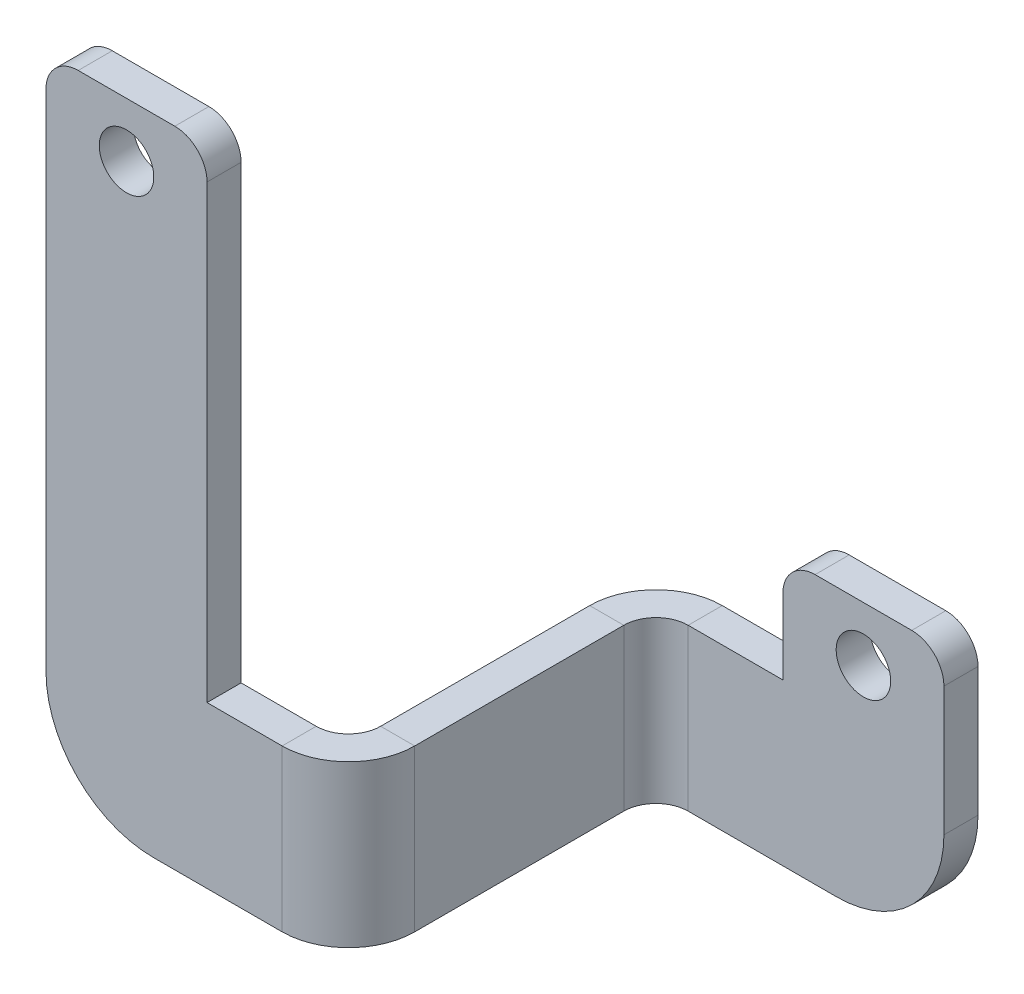
ISO-10303-21;
HEADER;
FILE_DESCRIPTION(('STEP AP214'),'2;1');
FILE_NAME('part.step','',(''),(''),'','','');
FILE_SCHEMA(('AUTOMOTIVE_DESIGN { 1 0 10303 214 1 1 1 1 }'));
ENDSEC;
DATA;
#1=APPLICATION_CONTEXT('core data for automotive mechanical design processes');
#2=APPLICATION_PROTOCOL_DEFINITION('international standard','automotive_design',2000,#1);
#3=PRODUCT_CONTEXT('',#1,'mechanical');
#4=PRODUCT('Part','Part','',(#3));
#5=PRODUCT_RELATED_PRODUCT_CATEGORY('part','',(#4));
#6=PRODUCT_DEFINITION_FORMATION('','',#4);
#7=PRODUCT_DEFINITION_CONTEXT('part definition',#1,'design');
#8=PRODUCT_DEFINITION('design','',#6,#7);
#9=PRODUCT_DEFINITION_SHAPE('','',#8);
#10=(LENGTH_UNIT() NAMED_UNIT(*) SI_UNIT(.MILLI.,.METRE.));
#11=(NAMED_UNIT(*) PLANE_ANGLE_UNIT() SI_UNIT($,.RADIAN.));
#12=(NAMED_UNIT(*) SI_UNIT($,.STERADIAN.) SOLID_ANGLE_UNIT());
#13=UNCERTAINTY_MEASURE_WITH_UNIT(LENGTH_MEASURE(1.E-05),#10,'distance_accuracy_value','');
#14=(GEOMETRIC_REPRESENTATION_CONTEXT(3) GLOBAL_UNCERTAINTY_ASSIGNED_CONTEXT((#13)) GLOBAL_UNIT_ASSIGNED_CONTEXT((#10,
#11,#12)) REPRESENTATION_CONTEXT('',''));
#15=CARTESIAN_POINT('',(0.,0.,0.));
#16=DIRECTION('',(0.,0.,1.));
#17=DIRECTION('',(1.,0.,0.));
#18=AXIS2_PLACEMENT_3D('',#15,#16,#17);
#19=CARTESIAN_POINT('',(15.6750000000001,7.5,-31.825));
#20=DIRECTION('',(0.,1.,0.));
#21=DIRECTION('',(0.,0.,1.));
#22=AXIS2_PLACEMENT_3D('',#19,#20,#21);
#23=PLANE('',#22);
#24=DIRECTION('',(-1.,0.,0.));
#25=VECTOR('',#24,1.);
#26=CARTESIAN_POINT('',(15.6750000000001,7.5,-28.65));
#27=LINE('',#26,#25);
#28=CARTESIAN_POINT('',(27.5000000000001,7.5,-28.65));
#29=VERTEX_POINT('',#28);
#30=CARTESIAN_POINT('',(18.6750000000001,7.5,-28.65));
#31=VERTEX_POINT('',#30);
#32=EDGE_CURVE('E208',#29,#31,#27,.T.);
#33=ORIENTED_EDGE('',*,*,#32,.F.);
#34=DIRECTION('',(0.,0.,1.));
#35=VECTOR('',#34,1.);
#36=CARTESIAN_POINT('',(27.5000000000001,7.5,-31.825));
#37=LINE('',#36,#35);
#38=CARTESIAN_POINT('',(27.5000000000001,7.5,-31.825));
#39=VERTEX_POINT('',#38);
#40=EDGE_CURVE('E194',#39,#29,#37,.T.);
#41=ORIENTED_EDGE('',*,*,#40,.F.);
#42=DIRECTION('',(-1.,0.,0.));
#43=VECTOR('',#42,1.);
#44=CARTESIAN_POINT('',(15.6750000000001,7.5,-31.825));
#45=LINE('',#44,#43);
#46=CARTESIAN_POINT('',(18.6750000000001,7.5,-31.825));
#47=VERTEX_POINT('',#46);
#48=EDGE_CURVE('E206',#39,#47,#45,.T.);
#49=ORIENTED_EDGE('',*,*,#48,.T.);
#50=DIRECTION('',(0.,0.,-1.));
#51=VECTOR('',#50,1.);
#52=CARTESIAN_POINT('',(18.6750000000001,7.5,-28.65));
#53=LINE('',#52,#51);
#54=EDGE_CURVE('E402',#31,#47,#53,.T.);
#55=ORIENTED_EDGE('',*,*,#54,.F.);
#56=EDGE_LOOP('',(#33,#41,#49,#55));
#57=FACE_BOUND('',#56,.T.);
#58=ADVANCED_FACE('F43',(#57),#23,.T.);
#59=CARTESIAN_POINT('',(-12.5,7.5,-3.175));
#60=DIRECTION('',(0.,1.,0.));
#61=DIRECTION('',(0.,0.,1.));
#62=AXIS2_PLACEMENT_3D('',#59,#60,#61);
#63=PLANE('',#62);
#64=DIRECTION('',(-1.,0.,0.));
#65=VECTOR('',#64,1.);
#66=CARTESIAN_POINT('',(-12.5,7.5,-3.175));
#67=LINE('',#66,#65);
#68=CARTESIAN_POINT('',(9.50000000000002,7.5,-3.175));
#69=VERTEX_POINT('',#68);
#70=CARTESIAN_POINT('',(2.5,7.5,-3.175));
#71=VERTEX_POINT('',#70);
#72=EDGE_CURVE('E297',#69,#71,#67,.T.);
#73=ORIENTED_EDGE('',*,*,#72,.T.);
#74=DIRECTION('',(0.,0.,-1.));
#75=VECTOR('',#74,1.);
#76=CARTESIAN_POINT('',(2.5,7.5,-3.175));
#77=LINE('',#76,#75);
#78=CARTESIAN_POINT('',(2.5,7.5,0.));
#79=VERTEX_POINT('',#78);
#80=EDGE_CURVE('E390',#79,#71,#77,.T.);
#81=ORIENTED_EDGE('',*,*,#80,.F.);
#82=DIRECTION('',(-1.,0.,0.));
#83=VECTOR('',#82,1.);
#84=CARTESIAN_POINT('',(-12.5,7.5,0.));
#85=LINE('',#84,#83);
#86=CARTESIAN_POINT('',(9.50000000000002,7.5,0.));
#87=VERTEX_POINT('',#86);
#88=EDGE_CURVE('E294',#87,#79,#85,.T.);
#89=ORIENTED_EDGE('',*,*,#88,.F.);
#90=DIRECTION('',(0.,0.,1.));
#91=VECTOR('',#90,1.);
#92=CARTESIAN_POINT('',(9.50000000000002,7.5,-3.175));
#93=LINE('',#92,#91);
#94=EDGE_CURVE('E291',#69,#87,#93,.T.);
#95=ORIENTED_EDGE('',*,*,#94,.F.);
#96=EDGE_LOOP('',(#73,#81,#89,#95));
#97=FACE_BOUND('',#96,.T.);
#98=ADVANCED_FACE('F458',(#97),#63,.T.);
#99=CARTESIAN_POINT('',(15.6750000000001,7.5,-28.65));
#100=DIRECTION('',(0.,1.,0.));
#101=DIRECTION('',(0.,0.,1.));
#102=AXIS2_PLACEMENT_3D('',#99,#100,#101);
#103=PLANE('',#102);
#104=DIRECTION('',(0.,0.,-1.));
#105=VECTOR('',#104,1.);
#106=CARTESIAN_POINT('',(15.6750000000001,7.5,-28.65));
#107=LINE('',#106,#105);
#108=CARTESIAN_POINT('',(15.675,7.5,-6.17499999999998));
#109=VERTEX_POINT('',#108);
#110=CARTESIAN_POINT('',(15.6750000000001,7.5,-25.65));
#111=VERTEX_POINT('',#110);
#112=EDGE_CURVE('E264',#109,#111,#107,.T.);
#113=ORIENTED_EDGE('',*,*,#112,.T.);
#114=DIRECTION('',(-1.,0.,0.));
#115=VECTOR('',#114,1.);
#116=CARTESIAN_POINT('',(15.6750000000001,7.5,-25.65));
#117=LINE('',#116,#115);
#118=CARTESIAN_POINT('',(12.5000000000001,7.5,-25.65));
#119=VERTEX_POINT('',#118);
#120=EDGE_CURVE('E239',#111,#119,#117,.T.);
#121=ORIENTED_EDGE('',*,*,#120,.T.);
#122=DIRECTION('',(0.,0.,-1.));
#123=VECTOR('',#122,1.);
#124=CARTESIAN_POINT('',(12.5000000000001,7.5,-28.65));
#125=LINE('',#124,#123);
#126=CARTESIAN_POINT('',(12.5,7.5,-6.17499999999999));
#127=VERTEX_POINT('',#126);
#128=EDGE_CURVE('E263',#127,#119,#125,.T.);
#129=ORIENTED_EDGE('',*,*,#128,.F.);
#130=DIRECTION('',(1.,0.,0.));
#131=VECTOR('',#130,1.);
#132=CARTESIAN_POINT('',(12.5,7.5,-6.17499999999999));
#133=LINE('',#132,#131);
#134=EDGE_CURVE('E250',#127,#109,#133,.T.);
#135=ORIENTED_EDGE('',*,*,#134,.T.);
#136=EDGE_LOOP('',(#113,#121,#129,#135));
#137=FACE_BOUND('',#136,.T.);
#138=ADVANCED_FACE('F463',(#137),#103,.T.);
#139=CARTESIAN_POINT('',(15.675,0.,0.));
#140=DIRECTION('',(1.,0.,0.));
#141=DIRECTION('',(0.,0.,-1.));
#142=AXIS2_PLACEMENT_3D('',#139,#140,#141);
#143=PLANE('',#142);
#144=DIRECTION('',(0.,0.,1.));
#145=VECTOR('',#144,1.);
#146=CARTESIAN_POINT('',(15.675,-7.5,-3.17499999999999));
#147=LINE('',#146,#145);
#148=CARTESIAN_POINT('',(15.6750000000001,-7.5,-25.65));
#149=VERTEX_POINT('',#148);
#150=CARTESIAN_POINT('',(15.675,-7.5,-6.17499999999998));
#151=VERTEX_POINT('',#150);
#152=EDGE_CURVE('E267',#149,#151,#147,.T.);
#153=ORIENTED_EDGE('',*,*,#152,.F.);
#154=DIRECTION('',(0.,1.,0.));
#155=VECTOR('',#154,1.);
#156=CARTESIAN_POINT('',(15.6750000000001,7.5,-25.65));
#157=LINE('',#156,#155);
#158=EDGE_CURVE('E221',#111,#149,#157,.F.);
#159=ORIENTED_EDGE('',*,*,#158,.F.);
#160=ORIENTED_EDGE('',*,*,#112,.F.);
#161=DIRECTION('',(0.,-1.,0.));
#162=VECTOR('',#161,1.);
#163=CARTESIAN_POINT('',(15.675,0.,-6.17499999999998));
#164=LINE('',#163,#162);
#165=EDGE_CURVE('E258',#109,#151,#164,.T.);
#166=ORIENTED_EDGE('',*,*,#165,.T.);
#167=EDGE_LOOP('',(#153,#159,#160,#166));
#168=FACE_BOUND('',#167,.T.);
#169=ADVANCED_FACE('F491',(#168),#143,.T.);
#170=CARTESIAN_POINT('',(12.5,0.,0.));
#171=DIRECTION('',(1.,0.,0.));
#172=DIRECTION('',(0.,0.,-1.));
#173=AXIS2_PLACEMENT_3D('',#170,#171,#172);
#174=PLANE('',#173);
#175=DIRECTION('',(0.,1.,0.));
#176=VECTOR('',#175,1.);
#177=CARTESIAN_POINT('',(12.5000000000001,7.5,-25.65));
#178=LINE('',#177,#176);
#179=CARTESIAN_POINT('',(12.5000000000001,-7.5,-25.65));
#180=VERTEX_POINT('',#179);
#181=EDGE_CURVE('E233',#119,#180,#178,.F.);
#182=ORIENTED_EDGE('',*,*,#181,.T.);
#183=DIRECTION('',(0.,0.,1.));
#184=VECTOR('',#183,1.);
#185=CARTESIAN_POINT('',(12.5,-7.5,-3.175));
#186=LINE('',#185,#184);
#187=CARTESIAN_POINT('',(12.5,-7.5,-6.17499999999999));
#188=VERTEX_POINT('',#187);
#189=EDGE_CURVE('E268',#180,#188,#186,.T.);
#190=ORIENTED_EDGE('',*,*,#189,.T.);
#191=DIRECTION('',(0.,-1.,0.));
#192=VECTOR('',#191,1.);
#193=CARTESIAN_POINT('',(12.5,7.5,-6.17499999999999));
#194=LINE('',#193,#192);
#195=EDGE_CURVE('E252',#127,#188,#194,.T.);
#196=ORIENTED_EDGE('',*,*,#195,.F.);
#197=ORIENTED_EDGE('',*,*,#128,.T.);
#198=EDGE_LOOP('',(#182,#190,#196,#197));
#199=FACE_BOUND('',#198,.T.);
#200=ADVANCED_FACE('F494',(#199),#174,.F.);
#201=CARTESIAN_POINT('',(-12.5,-7.5,-3.175));
#202=DIRECTION('',(0.,-1.,0.));
#203=DIRECTION('',(0.,0.,-1.));
#204=AXIS2_PLACEMENT_3D('',#201,#202,#203);
#205=PLANE('',#204);
#206=DIRECTION('',(1.,0.,0.));
#207=VECTOR('',#206,1.);
#208=CARTESIAN_POINT('',(-12.5,-7.5,0.));
#209=LINE('',#208,#207);
#210=CARTESIAN_POINT('',(-2.5,-7.5,0.));
#211=VERTEX_POINT('',#210);
#212=CARTESIAN_POINT('',(9.50000000000002,-7.5,0.));
#213=VERTEX_POINT('',#212);
#214=EDGE_CURVE('E301',#211,#213,#209,.T.);
#215=ORIENTED_EDGE('',*,*,#214,.F.);
#216=DIRECTION('',(0.,0.,1.));
#217=VECTOR('',#216,1.);
#218=CARTESIAN_POINT('',(-2.5,-7.5,-3.175));
#219=LINE('',#218,#217);
#220=CARTESIAN_POINT('',(-2.5,-7.5,-3.175));
#221=VERTEX_POINT('',#220);
#222=EDGE_CURVE('E51',#211,#221,#219,.F.);
#223=ORIENTED_EDGE('',*,*,#222,.T.);
#224=DIRECTION('',(1.,0.,0.));
#225=VECTOR('',#224,1.);
#226=CARTESIAN_POINT('',(-12.5,-7.5,-3.175));
#227=LINE('',#226,#225);
#228=CARTESIAN_POINT('',(9.50000000000002,-7.5,-3.175));
#229=VERTEX_POINT('',#228);
#230=EDGE_CURVE('E304',#221,#229,#227,.T.);
#231=ORIENTED_EDGE('',*,*,#230,.T.);
#232=DIRECTION('',(0.,0.,1.));
#233=VECTOR('',#232,1.);
#234=CARTESIAN_POINT('',(9.50000000000002,-7.5,-3.175));
#235=LINE('',#234,#233);
#236=EDGE_CURVE('E280',#229,#213,#235,.T.);
#237=ORIENTED_EDGE('',*,*,#236,.T.);
#238=EDGE_LOOP('',(#215,#223,#231,#237));
#239=FACE_BOUND('',#238,.T.);
#240=ADVANCED_FACE('F448',(#239),#205,.T.);
#241=CARTESIAN_POINT('',(0.,0.,-3.175));
#242=DIRECTION('',(0.,0.,-1.));
#243=DIRECTION('',(-1.,0.,0.));
#244=AXIS2_PLACEMENT_3D('',#241,#242,#243);
#245=PLANE('',#244);
#246=CARTESIAN_POINT('',(-5.,47.42,-3.175));
#247=DIRECTION('',(0.,0.,-1.));
#248=DIRECTION('',(-1.,0.,0.));
#249=AXIS2_PLACEMENT_3D('',#246,#247,#248);
#250=CIRCLE('',#249,2.54000000000001);
#251=CARTESIAN_POINT('',(-7.54,47.42,-3.175));
#252=VERTEX_POINT('',#251);
#253=EDGE_CURVE('E201',#252,#252,#250,.T.);
#254=ORIENTED_EDGE('',*,*,#253,.F.);
#255=EDGE_LOOP('',(#254));
#256=FACE_BOUND('',#255,.T.);
#257=ORIENTED_EDGE('',*,*,#230,.F.);
#258=CARTESIAN_POINT('',(-2.5,2.5,-3.175));
#259=DIRECTION('',(0.,0.,-1.));
#260=DIRECTION('',(-1.,0.,0.));
#261=AXIS2_PLACEMENT_3D('',#258,#259,#260);
#262=CIRCLE('',#261,10.);
#263=CARTESIAN_POINT('',(-12.5,2.5,-3.175));
#264=VERTEX_POINT('',#263);
#265=EDGE_CURVE('E11',#221,#264,#262,.T.);
#266=ORIENTED_EDGE('',*,*,#265,.T.);
#267=DIRECTION('',(0.,-1.,0.));
#268=VECTOR('',#267,1.);
#269=CARTESIAN_POINT('',(-12.5,-7.5,-3.175));
#270=LINE('',#269,#268);
#271=CARTESIAN_POINT('',(-12.5,49.5,-3.175));
#272=VERTEX_POINT('',#271);
#273=EDGE_CURVE('E300',#272,#264,#270,.T.);
#274=ORIENTED_EDGE('',*,*,#273,.F.);
#275=CARTESIAN_POINT('',(-9.49999999999999,49.5,-3.175));
#276=DIRECTION('',(0.,0.,-1.));
#277=DIRECTION('',(-1.,0.,0.));
#278=AXIS2_PLACEMENT_3D('',#275,#276,#277);
#279=CIRCLE('',#278,3.);
#280=CARTESIAN_POINT('',(-9.49999999999999,52.5,-3.175));
#281=VERTEX_POINT('',#280);
#282=EDGE_CURVE('E339',#272,#281,#279,.T.);
#283=ORIENTED_EDGE('',*,*,#282,.T.);
#284=DIRECTION('',(-1.,0.,0.));
#285=VECTOR('',#284,1.);
#286=CARTESIAN_POINT('',(-12.5,52.5,-3.175));
#287=LINE('',#286,#285);
#288=CARTESIAN_POINT('',(-0.499999999999995,52.5,-3.175));
#289=VERTEX_POINT('',#288);
#290=EDGE_CURVE('E384',#289,#281,#287,.T.);
#291=ORIENTED_EDGE('',*,*,#290,.F.);
#292=CARTESIAN_POINT('',(-0.499999999999996,49.5,-3.175));
#293=DIRECTION('',(0.,0.,-1.));
#294=DIRECTION('',(-1.,0.,0.));
#295=AXIS2_PLACEMENT_3D('',#292,#293,#294);
#296=CIRCLE('',#295,3.);
#297=CARTESIAN_POINT('',(2.5,49.5,-3.175));
#298=VERTEX_POINT('',#297);
#299=EDGE_CURVE('E341',#289,#298,#296,.T.);
#300=ORIENTED_EDGE('',*,*,#299,.T.);
#301=DIRECTION('',(0.,-1.,0.));
#302=VECTOR('',#301,1.);
#303=CARTESIAN_POINT('',(2.5,52.5,-3.175));
#304=LINE('',#303,#302);
#305=EDGE_CURVE('E386',#298,#71,#304,.T.);
#306=ORIENTED_EDGE('',*,*,#305,.T.);
#307=ORIENTED_EDGE('',*,*,#72,.F.);
#308=DIRECTION('',(0.,-1.,0.));
#309=VECTOR('',#308,1.);
#310=CARTESIAN_POINT('',(9.50000000000002,-7.5,-3.175));
#311=LINE('',#310,#309);
#312=EDGE_CURVE('E286',#229,#69,#311,.F.);
#313=ORIENTED_EDGE('',*,*,#312,.F.);
#314=EDGE_LOOP('',(#257,#266,#274,#283,#291,#300,#306,#307,#313));
#315=FACE_BOUND('',#314,.T.);
#316=ADVANCED_FACE('F446',(#256,#315),#245,.T.);
#317=CARTESIAN_POINT('',(0.,0.,0.));
#318=DIRECTION('',(0.,0.,-1.));
#319=DIRECTION('',(-1.,0.,0.));
#320=AXIS2_PLACEMENT_3D('',#317,#318,#319);
#321=PLANE('',#320);
#322=CARTESIAN_POINT('',(-5.,47.42,0.));
#323=DIRECTION('',(0.,0.,-1.));
#324=DIRECTION('',(-1.,0.,0.));
#325=AXIS2_PLACEMENT_3D('',#322,#323,#324);
#326=CIRCLE('',#325,2.54000000000001);
#327=CARTESIAN_POINT('',(-7.54,47.42,0.));
#328=VERTEX_POINT('',#327);
#329=EDGE_CURVE('E395',#328,#328,#326,.T.);
#330=ORIENTED_EDGE('',*,*,#329,.T.);
#331=EDGE_LOOP('',(#330));
#332=FACE_BOUND('',#331,.T.);
#333=DIRECTION('',(0.,-1.,0.));
#334=VECTOR('',#333,1.);
#335=CARTESIAN_POINT('',(-12.5,-7.5,0.));
#336=LINE('',#335,#334);
#337=CARTESIAN_POINT('',(-12.5,49.5,0.));
#338=VERTEX_POINT('',#337);
#339=CARTESIAN_POINT('',(-12.5,2.5,0.));
#340=VERTEX_POINT('',#339);
#341=EDGE_CURVE('E309',#338,#340,#336,.T.);
#342=ORIENTED_EDGE('',*,*,#341,.T.);
#343=CARTESIAN_POINT('',(-2.5,2.5,0.));
#344=DIRECTION('',(0.,0.,-1.));
#345=DIRECTION('',(-1.,0.,0.));
#346=AXIS2_PLACEMENT_3D('',#343,#344,#345);
#347=CIRCLE('',#346,10.);
#348=EDGE_CURVE('E65',#340,#211,#347,.F.);
#349=ORIENTED_EDGE('',*,*,#348,.T.);
#350=ORIENTED_EDGE('',*,*,#214,.T.);
#351=DIRECTION('',(0.,-1.,0.));
#352=VECTOR('',#351,1.);
#353=CARTESIAN_POINT('',(9.50000000000002,-7.5,0.));
#354=LINE('',#353,#352);
#355=EDGE_CURVE('E274',#213,#87,#354,.F.);
#356=ORIENTED_EDGE('',*,*,#355,.T.);
#357=ORIENTED_EDGE('',*,*,#88,.T.);
#358=DIRECTION('',(0.,-1.,0.));
#359=VECTOR('',#358,1.);
#360=CARTESIAN_POINT('',(2.5,52.5,0.));
#361=LINE('',#360,#359);
#362=CARTESIAN_POINT('',(2.5,49.5,0.));
#363=VERTEX_POINT('',#362);
#364=EDGE_CURVE('E388',#363,#79,#361,.T.);
#365=ORIENTED_EDGE('',*,*,#364,.F.);
#366=CARTESIAN_POINT('',(-0.499999999999996,49.5,0.));
#367=DIRECTION('',(0.,0.,-1.));
#368=DIRECTION('',(-1.,0.,0.));
#369=AXIS2_PLACEMENT_3D('',#366,#367,#368);
#370=CIRCLE('',#369,3.);
#371=CARTESIAN_POINT('',(-0.499999999999999,52.5,0.));
#372=VERTEX_POINT('',#371);
#373=EDGE_CURVE('E347',#363,#372,#370,.F.);
#374=ORIENTED_EDGE('',*,*,#373,.T.);
#375=DIRECTION('',(1.,0.,0.));
#376=VECTOR('',#375,1.);
#377=CARTESIAN_POINT('',(-12.5,52.5,0.));
#378=LINE('',#377,#376);
#379=CARTESIAN_POINT('',(-9.49999999999999,52.5,0.));
#380=VERTEX_POINT('',#379);
#381=EDGE_CURVE('E374',#380,#372,#378,.T.);
#382=ORIENTED_EDGE('',*,*,#381,.F.);
#383=CARTESIAN_POINT('',(-9.49999999999999,49.5,0.));
#384=DIRECTION('',(0.,0.,-1.));
#385=DIRECTION('',(-1.,0.,0.));
#386=AXIS2_PLACEMENT_3D('',#383,#384,#385);
#387=CIRCLE('',#386,3.);
#388=EDGE_CURVE('E345',#380,#338,#387,.F.);
#389=ORIENTED_EDGE('',*,*,#388,.T.);
#390=EDGE_LOOP('',(#342,#349,#350,#356,#357,#365,#374,#382,#389));
#391=FACE_BOUND('',#390,.T.);
#392=ADVANCED_FACE('F371',(#332,#391),#321,.F.);
#393=CARTESIAN_POINT('',(-12.5,-7.5,-3.175));
#394=DIRECTION('',(-1.,0.,0.));
#395=DIRECTION('',(0.,0.,1.));
#396=AXIS2_PLACEMENT_3D('',#393,#394,#395);
#397=PLANE('',#396);
#398=ORIENTED_EDGE('',*,*,#273,.T.);
#399=DIRECTION('',(0.,0.,1.));
#400=VECTOR('',#399,1.);
#401=CARTESIAN_POINT('',(-12.5,2.5,-3.175));
#402=LINE('',#401,#400);
#403=EDGE_CURVE('E360',#264,#340,#402,.T.);
#404=ORIENTED_EDGE('',*,*,#403,.T.);
#405=ORIENTED_EDGE('',*,*,#341,.F.);
#406=DIRECTION('',(0.,0.,1.));
#407=VECTOR('',#406,1.);
#408=CARTESIAN_POINT('',(-12.5,49.5,-3.175));
#409=LINE('',#408,#407);
#410=EDGE_CURVE('E349',#338,#272,#409,.F.);
#411=ORIENTED_EDGE('',*,*,#410,.T.);
#412=EDGE_LOOP('',(#398,#404,#405,#411));
#413=FACE_BOUND('',#412,.T.);
#414=ADVANCED_FACE('F366',(#413),#397,.T.);
#415=CARTESIAN_POINT('',(9.50000000000002,7.5,-6.175));
#416=DIRECTION('',(0.,1.,0.));
#417=DIRECTION('',(0.,0.,1.));
#418=AXIS2_PLACEMENT_3D('',#415,#416,#417);
#419=PLANE('',#418);
#420=ORIENTED_EDGE('',*,*,#134,.F.);
#421=CARTESIAN_POINT('',(9.50000000000002,7.5,-6.175));
#422=DIRECTION('',(0.,-1.,0.));
#423=DIRECTION('',(0.,0.,-1.));
#424=AXIS2_PLACEMENT_3D('',#421,#422,#423);
#425=CIRCLE('',#424,3.);
#426=EDGE_CURVE('E283',#69,#127,#425,.F.);
#427=ORIENTED_EDGE('',*,*,#426,.F.);
#428=ORIENTED_EDGE('',*,*,#94,.T.);
#429=CARTESIAN_POINT('',(9.50000000000002,7.5,-6.175));
#430=DIRECTION('',(0.,-1.,0.));
#431=DIRECTION('',(0.,0.,-1.));
#432=AXIS2_PLACEMENT_3D('',#429,#430,#431);
#433=CIRCLE('',#432,6.175);
#434=EDGE_CURVE('E276',#87,#109,#433,.F.);
#435=ORIENTED_EDGE('',*,*,#434,.T.);
#436=EDGE_LOOP('',(#420,#427,#428,#435));
#437=FACE_BOUND('',#436,.T.);
#438=ADVANCED_FACE('F514',(#437),#419,.T.);
#439=CARTESIAN_POINT('',(9.50000000000002,-7.5,-6.175));
#440=DIRECTION('',(0.,1.,0.));
#441=DIRECTION('',(0.,0.,1.));
#442=AXIS2_PLACEMENT_3D('',#439,#440,#441);
#443=PLANE('',#442);
#444=CARTESIAN_POINT('',(9.50000000000002,-7.5,-6.175));
#445=DIRECTION('',(0.,-1.,0.));
#446=DIRECTION('',(0.,0.,-1.));
#447=AXIS2_PLACEMENT_3D('',#444,#445,#446);
#448=CIRCLE('',#447,3.);
#449=EDGE_CURVE('E270',#188,#229,#448,.T.);
#450=ORIENTED_EDGE('',*,*,#449,.F.);
#451=DIRECTION('',(1.,0.,0.));
#452=VECTOR('',#451,1.);
#453=CARTESIAN_POINT('',(12.5,-7.5,-6.17499999999999));
#454=LINE('',#453,#452);
#455=EDGE_CURVE('E255',#188,#151,#454,.T.);
#456=ORIENTED_EDGE('',*,*,#455,.T.);
#457=CARTESIAN_POINT('',(9.50000000000002,-7.5,-6.175));
#458=DIRECTION('',(0.,-1.,0.));
#459=DIRECTION('',(0.,0.,-1.));
#460=AXIS2_PLACEMENT_3D('',#457,#458,#459);
#461=CIRCLE('',#460,6.175);
#462=EDGE_CURVE('E277',#151,#213,#461,.T.);
#463=ORIENTED_EDGE('',*,*,#462,.T.);
#464=ORIENTED_EDGE('',*,*,#236,.F.);
#465=EDGE_LOOP('',(#450,#456,#463,#464));
#466=FACE_BOUND('',#465,.T.);
#467=ADVANCED_FACE('F509',(#466),#443,.F.);
#468=CARTESIAN_POINT('',(9.50000000000002,-7.5,-6.175));
#469=DIRECTION('',(0.,-1.,0.));
#470=DIRECTION('',(1.,0.,0.));
#471=AXIS2_PLACEMENT_3D('',#468,#469,#470);
#472=CYLINDRICAL_SURFACE('',#471,6.175);
#473=ORIENTED_EDGE('',*,*,#355,.F.);
#474=ORIENTED_EDGE('',*,*,#462,.F.);
#475=ORIENTED_EDGE('',*,*,#165,.F.);
#476=ORIENTED_EDGE('',*,*,#434,.F.);
#477=EDGE_LOOP('',(#473,#474,#475,#476));
#478=FACE_BOUND('',#477,.T.);
#479=ADVANCED_FACE('F506',(#478),#472,.T.);
#480=CARTESIAN_POINT('',(9.50000000000002,-7.5,-6.175));
#481=DIRECTION('',(0.,-1.,0.));
#482=DIRECTION('',(1.,0.,0.));
#483=AXIS2_PLACEMENT_3D('',#480,#481,#482);
#484=CYLINDRICAL_SURFACE('',#483,3.);
#485=ORIENTED_EDGE('',*,*,#312,.T.);
#486=ORIENTED_EDGE('',*,*,#426,.T.);
#487=ORIENTED_EDGE('',*,*,#195,.T.);
#488=ORIENTED_EDGE('',*,*,#449,.T.);
#489=EDGE_LOOP('',(#485,#486,#487,#488));
#490=FACE_BOUND('',#489,.T.);
#491=ADVANCED_FACE('F501',(#490),#484,.F.);
#492=CARTESIAN_POINT('',(15.675,-7.5,-3.17499999999999));
#493=DIRECTION('',(0.,-1.,0.));
#494=DIRECTION('',(0.,0.,-1.));
#495=AXIS2_PLACEMENT_3D('',#492,#493,#494);
#496=PLANE('',#495);
#497=DIRECTION('',(-1.,0.,0.));
#498=VECTOR('',#497,1.);
#499=CARTESIAN_POINT('',(15.6750000000001,-7.5,-25.65));
#500=LINE('',#499,#498);
#501=EDGE_CURVE('E247',#149,#180,#500,.T.);
#502=ORIENTED_EDGE('',*,*,#501,.F.);
#503=ORIENTED_EDGE('',*,*,#152,.T.);
#504=ORIENTED_EDGE('',*,*,#455,.F.);
#505=ORIENTED_EDGE('',*,*,#189,.F.);
#506=EDGE_LOOP('',(#502,#503,#504,#505));
#507=FACE_BOUND('',#506,.T.);
#508=ADVANCED_FACE('F486',(#507),#496,.T.);
#509=CARTESIAN_POINT('',(18.6750000000001,-7.5,-25.65));
#510=DIRECTION('',(0.,-1.,0.));
#511=DIRECTION('',(0.,0.,-1.));
#512=AXIS2_PLACEMENT_3D('',#509,#510,#511);
#513=PLANE('',#512);
#514=DIRECTION('',(0.,0.,-1.));
#515=VECTOR('',#514,1.);
#516=CARTESIAN_POINT('',(18.6750000000001,-7.5,-28.65));
#517=LINE('',#516,#515);
#518=CARTESIAN_POINT('',(18.6750000000001,-7.5,-28.65));
#519=VERTEX_POINT('',#518);
#520=CARTESIAN_POINT('',(18.6750000000001,-7.5,-31.825));
#521=VERTEX_POINT('',#520);
#522=EDGE_CURVE('E398',#519,#521,#517,.T.);
#523=ORIENTED_EDGE('',*,*,#522,.F.);
#524=CARTESIAN_POINT('',(18.6750000000001,-7.5,-25.65));
#525=DIRECTION('',(0.,1.,0.));
#526=DIRECTION('',(0.,0.,1.));
#527=AXIS2_PLACEMENT_3D('',#524,#525,#526);
#528=CIRCLE('',#527,3.);
#529=EDGE_CURVE('E242',#149,#519,#528,.F.);
#530=ORIENTED_EDGE('',*,*,#529,.F.);
#531=ORIENTED_EDGE('',*,*,#501,.T.);
#532=CARTESIAN_POINT('',(18.6750000000001,-7.5,-25.65));
#533=DIRECTION('',(0.,1.,0.));
#534=DIRECTION('',(0.,0.,1.));
#535=AXIS2_PLACEMENT_3D('',#532,#533,#534);
#536=CIRCLE('',#535,6.175);
#537=EDGE_CURVE('E235',#180,#521,#536,.F.);
#538=ORIENTED_EDGE('',*,*,#537,.T.);
#539=EDGE_LOOP('',(#523,#530,#531,#538));
#540=FACE_BOUND('',#539,.T.);
#541=ADVANCED_FACE('F483',(#540),#513,.T.);
#542=CARTESIAN_POINT('',(18.6750000000001,7.5,-25.65));
#543=DIRECTION('',(0.,-1.,0.));
#544=DIRECTION('',(0.,0.,-1.));
#545=AXIS2_PLACEMENT_3D('',#542,#543,#544);
#546=PLANE('',#545);
#547=CARTESIAN_POINT('',(18.6750000000001,7.5,-25.65));
#548=DIRECTION('',(0.,1.,0.));
#549=DIRECTION('',(0.,0.,1.));
#550=AXIS2_PLACEMENT_3D('',#547,#548,#549);
#551=CIRCLE('',#550,3.);
#552=EDGE_CURVE('E217',#31,#111,#551,.T.);
#553=ORIENTED_EDGE('',*,*,#552,.F.);
#554=ORIENTED_EDGE('',*,*,#54,.T.);
#555=CARTESIAN_POINT('',(18.6750000000001,7.5,-25.65));
#556=DIRECTION('',(0.,1.,0.));
#557=DIRECTION('',(0.,0.,1.));
#558=AXIS2_PLACEMENT_3D('',#555,#556,#557);
#559=CIRCLE('',#558,6.175);
#560=EDGE_CURVE('E236',#47,#119,#559,.T.);
#561=ORIENTED_EDGE('',*,*,#560,.T.);
#562=ORIENTED_EDGE('',*,*,#120,.F.);
#563=EDGE_LOOP('',(#553,#554,#561,#562));
#564=FACE_BOUND('',#563,.T.);
#565=ADVANCED_FACE('F478',(#564),#546,.F.);
#566=CARTESIAN_POINT('',(18.6750000000001,7.5,-25.65));
#567=DIRECTION('',(0.,1.,0.));
#568=DIRECTION('',(0.,0.,-1.));
#569=AXIS2_PLACEMENT_3D('',#566,#567,#568);
#570=CYLINDRICAL_SURFACE('',#569,6.175);
#571=ORIENTED_EDGE('',*,*,#181,.F.);
#572=ORIENTED_EDGE('',*,*,#560,.F.);
#573=DIRECTION('',(0.,1.,0.));
#574=VECTOR('',#573,1.);
#575=CARTESIAN_POINT('',(18.6750000000001,0.,-31.825));
#576=LINE('',#575,#574);
#577=EDGE_CURVE('E216',#521,#47,#576,.T.);
#578=ORIENTED_EDGE('',*,*,#577,.F.);
#579=ORIENTED_EDGE('',*,*,#537,.F.);
#580=EDGE_LOOP('',(#571,#572,#578,#579));
#581=FACE_BOUND('',#580,.T.);
#582=ADVANCED_FACE('F475',(#581),#570,.T.);
#583=CARTESIAN_POINT('',(18.6750000000001,7.5,-25.65));
#584=DIRECTION('',(0.,1.,0.));
#585=DIRECTION('',(0.,0.,-1.));
#586=AXIS2_PLACEMENT_3D('',#583,#584,#585);
#587=CYLINDRICAL_SURFACE('',#586,3.);
#588=ORIENTED_EDGE('',*,*,#158,.T.);
#589=ORIENTED_EDGE('',*,*,#529,.T.);
#590=DIRECTION('',(0.,1.,0.));
#591=VECTOR('',#590,1.);
#592=CARTESIAN_POINT('',(18.6750000000001,-7.5,-28.65));
#593=LINE('',#592,#591);
#594=EDGE_CURVE('E399',#519,#31,#593,.T.);
#595=ORIENTED_EDGE('',*,*,#594,.T.);
#596=ORIENTED_EDGE('',*,*,#552,.T.);
#597=EDGE_LOOP('',(#588,#589,#595,#596));
#598=FACE_BOUND('',#597,.T.);
#599=ADVANCED_FACE('F474',(#598),#587,.F.);
#600=CARTESIAN_POINT('',(42.5000000000001,-7.5,-31.825));
#601=DIRECTION('',(0.,-1.,0.));
#602=DIRECTION('',(1.,0.,0.));
#603=AXIS2_PLACEMENT_3D('',#600,#601,#602);
#604=PLANE('',#603);
#605=DIRECTION('',(1.,0.,0.));
#606=VECTOR('',#605,1.);
#607=CARTESIAN_POINT('',(42.5000000000001,-7.5,-31.825));
#608=LINE('',#607,#606);
#609=CARTESIAN_POINT('',(32.5000000000001,-7.5,-31.825));
#610=VERTEX_POINT('',#609);
#611=EDGE_CURVE('E223',#521,#610,#608,.T.);
#612=ORIENTED_EDGE('',*,*,#611,.T.);
#613=DIRECTION('',(0.,0.,1.));
#614=VECTOR('',#613,1.);
#615=CARTESIAN_POINT('',(32.5000000000001,-7.5,-31.825));
#616=LINE('',#615,#614);
#617=CARTESIAN_POINT('',(32.5000000000001,-7.5,-28.65));
#618=VERTEX_POINT('',#617);
#619=EDGE_CURVE('E351',#610,#618,#616,.T.);
#620=ORIENTED_EDGE('',*,*,#619,.T.);
#621=DIRECTION('',(1.,0.,0.));
#622=VECTOR('',#621,1.);
#623=CARTESIAN_POINT('',(42.5000000000001,-7.5,-28.65));
#624=LINE('',#623,#622);
#625=EDGE_CURVE('E227',#519,#618,#624,.T.);
#626=ORIENTED_EDGE('',*,*,#625,.F.);
#627=ORIENTED_EDGE('',*,*,#522,.T.);
#628=EDGE_LOOP('',(#612,#620,#626,#627));
#629=FACE_BOUND('',#628,.T.);
#630=ADVANCED_FACE('F410',(#629),#604,.T.);
#631=CARTESIAN_POINT('',(0.,0.,-31.825));
#632=DIRECTION('',(0.,0.,-1.));
#633=DIRECTION('',(-1.,0.,0.));
#634=AXIS2_PLACEMENT_3D('',#631,#632,#633);
#635=PLANE('',#634);
#636=CARTESIAN_POINT('',(35.0000000000001,12.42,-31.825));
#637=DIRECTION('',(0.,0.,-1.));
#638=DIRECTION('',(-1.,0.,0.));
#639=AXIS2_PLACEMENT_3D('',#636,#637,#638);
#640=CIRCLE('',#639,2.54);
#641=CARTESIAN_POINT('',(32.4600000000001,12.42,-31.825));
#642=VERTEX_POINT('',#641);
#643=EDGE_CURVE('E314',#642,#642,#640,.T.);
#644=ORIENTED_EDGE('',*,*,#643,.F.);
#645=EDGE_LOOP('',(#644));
#646=FACE_BOUND('',#645,.T.);
#647=DIRECTION('',(0.,1.,0.));
#648=VECTOR('',#647,1.);
#649=CARTESIAN_POINT('',(42.5000000000001,7.5,-31.825));
#650=LINE('',#649,#648);
#651=CARTESIAN_POINT('',(42.5000000000001,2.5,-31.825));
#652=VERTEX_POINT('',#651);
#653=CARTESIAN_POINT('',(42.5000000000001,14.5,-31.825));
#654=VERTEX_POINT('',#653);
#655=EDGE_CURVE('E218',#652,#654,#650,.T.);
#656=ORIENTED_EDGE('',*,*,#655,.F.);
#657=CARTESIAN_POINT('',(32.5000000000001,2.5,-31.825));
#658=DIRECTION('',(0.,0.,-1.));
#659=DIRECTION('',(-1.,0.,0.));
#660=AXIS2_PLACEMENT_3D('',#657,#658,#659);
#661=CIRCLE('',#660,10.);
#662=EDGE_CURVE('E358',#652,#610,#661,.T.);
#663=ORIENTED_EDGE('',*,*,#662,.T.);
#664=ORIENTED_EDGE('',*,*,#611,.F.);
#665=ORIENTED_EDGE('',*,*,#577,.T.);
#666=ORIENTED_EDGE('',*,*,#48,.F.);
#667=DIRECTION('',(0.,-1.,0.));
#668=VECTOR('',#667,1.);
#669=CARTESIAN_POINT('',(27.5000000000001,17.5,-31.825));
#670=LINE('',#669,#668);
#671=CARTESIAN_POINT('',(27.5000000000001,14.5,-31.825));
#672=VERTEX_POINT('',#671);
#673=EDGE_CURVE('E190',#672,#39,#670,.T.);
#674=ORIENTED_EDGE('',*,*,#673,.F.);
#675=CARTESIAN_POINT('',(30.5000000000001,14.5,-31.825));
#676=DIRECTION('',(0.,0.,-1.));
#677=DIRECTION('',(-1.,0.,0.));
#678=AXIS2_PLACEMENT_3D('',#675,#676,#677);
#679=CIRCLE('',#678,3.);
#680=CARTESIAN_POINT('',(30.5000000000001,17.5,-31.825));
#681=VERTEX_POINT('',#680);
#682=EDGE_CURVE('E328',#672,#681,#679,.T.);
#683=ORIENTED_EDGE('',*,*,#682,.T.);
#684=DIRECTION('',(-1.,0.,0.));
#685=VECTOR('',#684,1.);
#686=CARTESIAN_POINT('',(42.5000000000001,17.5,-31.825));
#687=LINE('',#686,#685);
#688=CARTESIAN_POINT('',(39.5000000000001,17.5,-31.825));
#689=VERTEX_POINT('',#688);
#690=EDGE_CURVE('E209',#689,#681,#687,.T.);
#691=ORIENTED_EDGE('',*,*,#690,.F.);
#692=CARTESIAN_POINT('',(39.5000000000001,14.5,-31.825));
#693=DIRECTION('',(0.,0.,-1.));
#694=DIRECTION('',(-1.,0.,0.));
#695=AXIS2_PLACEMENT_3D('',#692,#693,#694);
#696=CIRCLE('',#695,3.);
#697=EDGE_CURVE('E325',#689,#654,#696,.T.);
#698=ORIENTED_EDGE('',*,*,#697,.T.);
#699=EDGE_LOOP('',(#656,#663,#664,#665,#666,#674,#683,#691,#698));
#700=FACE_BOUND('',#699,.T.);
#701=ADVANCED_FACE('F214',(#646,#700),#635,.T.);
#702=CARTESIAN_POINT('',(0.,0.,-28.65));
#703=DIRECTION('',(0.,0.,-1.));
#704=DIRECTION('',(-1.,0.,0.));
#705=AXIS2_PLACEMENT_3D('',#702,#703,#704);
#706=PLANE('',#705);
#707=CARTESIAN_POINT('',(35.0000000000001,12.42,-28.65));
#708=DIRECTION('',(0.,0.,-1.));
#709=DIRECTION('',(-1.,0.,0.));
#710=AXIS2_PLACEMENT_3D('',#707,#708,#709);
#711=CIRCLE('',#710,2.54);
#712=CARTESIAN_POINT('',(32.4600000000001,12.42,-28.65));
#713=VERTEX_POINT('',#712);
#714=EDGE_CURVE('E210',#713,#713,#711,.T.);
#715=ORIENTED_EDGE('',*,*,#714,.T.);
#716=EDGE_LOOP('',(#715));
#717=FACE_BOUND('',#716,.T.);
#718=ORIENTED_EDGE('',*,*,#625,.T.);
#719=CARTESIAN_POINT('',(32.5000000000001,2.5,-28.65));
#720=DIRECTION('',(0.,0.,-1.));
#721=DIRECTION('',(-1.,0.,0.));
#722=AXIS2_PLACEMENT_3D('',#719,#720,#721);
#723=CIRCLE('',#722,10.);
#724=CARTESIAN_POINT('',(42.5000000000001,2.5,-28.65));
#725=VERTEX_POINT('',#724);
#726=EDGE_CURVE('E354',#618,#725,#723,.F.);
#727=ORIENTED_EDGE('',*,*,#726,.T.);
#728=DIRECTION('',(0.,1.,0.));
#729=VECTOR('',#728,1.);
#730=CARTESIAN_POINT('',(42.5000000000001,7.5,-28.65));
#731=LINE('',#730,#729);
#732=CARTESIAN_POINT('',(42.5000000000001,14.5,-28.65));
#733=VERTEX_POINT('',#732);
#734=EDGE_CURVE('E230',#725,#733,#731,.T.);
#735=ORIENTED_EDGE('',*,*,#734,.T.);
#736=CARTESIAN_POINT('',(39.5000000000001,14.5,-28.65));
#737=DIRECTION('',(0.,0.,-1.));
#738=DIRECTION('',(-1.,0.,0.));
#739=AXIS2_PLACEMENT_3D('',#736,#737,#738);
#740=CIRCLE('',#739,3.);
#741=CARTESIAN_POINT('',(39.5000000000001,17.5,-28.65));
#742=VERTEX_POINT('',#741);
#743=EDGE_CURVE('E320',#733,#742,#740,.F.);
#744=ORIENTED_EDGE('',*,*,#743,.T.);
#745=DIRECTION('',(1.,0.,0.));
#746=VECTOR('',#745,1.);
#747=CARTESIAN_POINT('',(42.5000000000001,17.5,-28.65));
#748=LINE('',#747,#746);
#749=CARTESIAN_POINT('',(30.5000000000001,17.5,-28.65));
#750=VERTEX_POINT('',#749);
#751=EDGE_CURVE('E429',#750,#742,#748,.T.);
#752=ORIENTED_EDGE('',*,*,#751,.F.);
#753=CARTESIAN_POINT('',(30.5000000000001,14.5,-28.65));
#754=DIRECTION('',(0.,0.,-1.));
#755=DIRECTION('',(-1.,0.,0.));
#756=AXIS2_PLACEMENT_3D('',#753,#754,#755);
#757=CIRCLE('',#756,3.);
#758=CARTESIAN_POINT('',(27.5000000000001,14.5,-28.65));
#759=VERTEX_POINT('',#758);
#760=EDGE_CURVE('E322',#750,#759,#757,.F.);
#761=ORIENTED_EDGE('',*,*,#760,.T.);
#762=DIRECTION('',(0.,-1.,0.));
#763=VECTOR('',#762,1.);
#764=CARTESIAN_POINT('',(27.5000000000001,17.5,-28.65));
#765=LINE('',#764,#763);
#766=EDGE_CURVE('E202',#759,#29,#765,.T.);
#767=ORIENTED_EDGE('',*,*,#766,.T.);
#768=ORIENTED_EDGE('',*,*,#32,.T.);
#769=ORIENTED_EDGE('',*,*,#594,.F.);
#770=EDGE_LOOP('',(#718,#727,#735,#744,#752,#761,#767,#768,#769));
#771=FACE_BOUND('',#770,.T.);
#772=ADVANCED_FACE('F418',(#717,#771),#706,.F.);
#773=CARTESIAN_POINT('',(42.5000000000001,7.5,-31.825));
#774=DIRECTION('',(1.,0.,0.));
#775=DIRECTION('',(0.,0.,-1.));
#776=AXIS2_PLACEMENT_3D('',#773,#774,#775);
#777=PLANE('',#776);
#778=ORIENTED_EDGE('',*,*,#734,.F.);
#779=DIRECTION('',(0.,0.,1.));
#780=VECTOR('',#779,1.);
#781=CARTESIAN_POINT('',(42.5000000000001,2.5,-31.825));
#782=LINE('',#781,#780);
#783=EDGE_CURVE('E356',#725,#652,#782,.F.);
#784=ORIENTED_EDGE('',*,*,#783,.T.);
#785=ORIENTED_EDGE('',*,*,#655,.T.);
#786=DIRECTION('',(0.,0.,-1.));
#787=VECTOR('',#786,1.);
#788=CARTESIAN_POINT('',(42.5000000000001,14.5,-28.65));
#789=LINE('',#788,#787);
#790=EDGE_CURVE('E330',#654,#733,#789,.F.);
#791=ORIENTED_EDGE('',*,*,#790,.T.);
#792=EDGE_LOOP('',(#778,#784,#785,#791));
#793=FACE_BOUND('',#792,.T.);
#794=ADVANCED_FACE('F421',(#793),#777,.T.);
#795=CARTESIAN_POINT('',(2.5,52.5,-3.175));
#796=DIRECTION('',(-1.,0.,0.));
#797=DIRECTION('',(0.,0.,1.));
#798=AXIS2_PLACEMENT_3D('',#795,#796,#797);
#799=PLANE('',#798);
#800=ORIENTED_EDGE('',*,*,#305,.F.);
#801=DIRECTION('',(0.,0.,-1.));
#802=VECTOR('',#801,1.);
#803=CARTESIAN_POINT('',(2.5,49.5,0.));
#804=LINE('',#803,#802);
#805=EDGE_CURVE('E343',#298,#363,#804,.F.);
#806=ORIENTED_EDGE('',*,*,#805,.T.);
#807=ORIENTED_EDGE('',*,*,#364,.T.);
#808=ORIENTED_EDGE('',*,*,#80,.T.);
#809=EDGE_LOOP('',(#800,#806,#807,#808));
#810=FACE_BOUND('',#809,.T.);
#811=ADVANCED_FACE('F471',(#810),#799,.F.);
#812=CARTESIAN_POINT('',(0.,52.5,0.));
#813=DIRECTION('',(0.,1.,0.));
#814=DIRECTION('',(0.,0.,1.));
#815=AXIS2_PLACEMENT_3D('',#812,#813,#814);
#816=PLANE('',#815);
#817=ORIENTED_EDGE('',*,*,#381,.T.);
#818=DIRECTION('',(0.,0.,-1.));
#819=VECTOR('',#818,1.);
#820=CARTESIAN_POINT('',(-0.499999999999996,52.5,-3.175));
#821=LINE('',#820,#819);
#822=EDGE_CURVE('E336',#372,#289,#821,.T.);
#823=ORIENTED_EDGE('',*,*,#822,.T.);
#824=ORIENTED_EDGE('',*,*,#290,.T.);
#825=DIRECTION('',(0.,0.,1.));
#826=VECTOR('',#825,1.);
#827=CARTESIAN_POINT('',(-9.49999999999999,52.5,0.));
#828=LINE('',#827,#826);
#829=EDGE_CURVE('E333',#281,#380,#828,.T.);
#830=ORIENTED_EDGE('',*,*,#829,.T.);
#831=EDGE_LOOP('',(#817,#823,#824,#830));
#832=FACE_BOUND('',#831,.T.);
#833=ADVANCED_FACE('F381',(#832),#816,.T.);
#834=CARTESIAN_POINT('',(-5.,47.42,0.));
#835=DIRECTION('',(0.,0.,-1.));
#836=DIRECTION('',(-1.,0.,0.));
#837=AXIS2_PLACEMENT_3D('',#834,#835,#836);
#838=CYLINDRICAL_SURFACE('',#837,2.54000000000001);
#839=ORIENTED_EDGE('',*,*,#329,.F.);
#840=EDGE_LOOP('',(#839));
#841=FACE_BOUND('',#840,.T.);
#842=ORIENTED_EDGE('',*,*,#253,.T.);
#843=EDGE_LOOP('',(#842));
#844=FACE_BOUND('',#843,.T.);
#845=ADVANCED_FACE('F444',(#841,#844),#838,.F.);
#846=CARTESIAN_POINT('',(27.5000000000001,17.5,-31.825));
#847=DIRECTION('',(1.,0.,0.));
#848=DIRECTION('',(0.,0.,-1.));
#849=AXIS2_PLACEMENT_3D('',#846,#847,#848);
#850=PLANE('',#849);
#851=ORIENTED_EDGE('',*,*,#766,.F.);
#852=DIRECTION('',(0.,0.,1.));
#853=VECTOR('',#852,1.);
#854=CARTESIAN_POINT('',(27.5000000000001,14.5,-31.825));
#855=LINE('',#854,#853);
#856=EDGE_CURVE('E197',#759,#672,#855,.F.);
#857=ORIENTED_EDGE('',*,*,#856,.T.);
#858=ORIENTED_EDGE('',*,*,#673,.T.);
#859=ORIENTED_EDGE('',*,*,#40,.T.);
#860=EDGE_LOOP('',(#851,#857,#858,#859));
#861=FACE_BOUND('',#860,.T.);
#862=ADVANCED_FACE('F193',(#861),#850,.F.);
#863=CARTESIAN_POINT('',(0.,17.5,0.));
#864=DIRECTION('',(0.,-1.,0.));
#865=DIRECTION('',(0.,0.,-1.));
#866=AXIS2_PLACEMENT_3D('',#863,#864,#865);
#867=PLANE('',#866);
#868=ORIENTED_EDGE('',*,*,#690,.T.);
#869=DIRECTION('',(0.,0.,1.));
#870=VECTOR('',#869,1.);
#871=CARTESIAN_POINT('',(30.5000000000001,17.5,0.));
#872=LINE('',#871,#870);
#873=EDGE_CURVE('E317',#681,#750,#872,.T.);
#874=ORIENTED_EDGE('',*,*,#873,.T.);
#875=ORIENTED_EDGE('',*,*,#751,.T.);
#876=DIRECTION('',(0.,0.,-1.));
#877=VECTOR('',#876,1.);
#878=CARTESIAN_POINT('',(39.5000000000001,17.5,-31.825));
#879=LINE('',#878,#877);
#880=EDGE_CURVE('E306',#742,#689,#879,.T.);
#881=ORIENTED_EDGE('',*,*,#880,.T.);
#882=EDGE_LOOP('',(#868,#874,#875,#881));
#883=FACE_BOUND('',#882,.T.);
#884=ADVANCED_FACE('F432',(#883),#867,.F.);
#885=CARTESIAN_POINT('',(35.0000000000001,12.42,0.));
#886=DIRECTION('',(0.,0.,-1.));
#887=DIRECTION('',(-1.,0.,0.));
#888=AXIS2_PLACEMENT_3D('',#885,#886,#887);
#889=CYLINDRICAL_SURFACE('',#888,2.54);
#890=ORIENTED_EDGE('',*,*,#643,.T.);
#891=EDGE_LOOP('',(#890));
#892=FACE_BOUND('',#891,.T.);
#893=ORIENTED_EDGE('',*,*,#714,.F.);
#894=EDGE_LOOP('',(#893));
#895=FACE_BOUND('',#894,.T.);
#896=ADVANCED_FACE('F531',(#892,#895),#889,.F.);
#897=CARTESIAN_POINT('',(30.5000000000001,14.5,0.));
#898=DIRECTION('',(0.,0.,1.));
#899=DIRECTION('',(1.,0.,0.));
#900=AXIS2_PLACEMENT_3D('',#897,#898,#899);
#901=CYLINDRICAL_SURFACE('',#900,3.);
#902=ORIENTED_EDGE('',*,*,#682,.F.);
#903=ORIENTED_EDGE('',*,*,#856,.F.);
#904=ORIENTED_EDGE('',*,*,#760,.F.);
#905=ORIENTED_EDGE('',*,*,#873,.F.);
#906=EDGE_LOOP('',(#902,#903,#904,#905));
#907=FACE_BOUND('',#906,.T.);
#908=ADVANCED_FACE('F528',(#907),#901,.T.);
#909=CARTESIAN_POINT('',(39.5000000000001,14.5,0.));
#910=DIRECTION('',(0.,0.,1.));
#911=DIRECTION('',(1.,0.,0.));
#912=AXIS2_PLACEMENT_3D('',#909,#910,#911);
#913=CYLINDRICAL_SURFACE('',#912,3.);
#914=ORIENTED_EDGE('',*,*,#743,.F.);
#915=ORIENTED_EDGE('',*,*,#790,.F.);
#916=ORIENTED_EDGE('',*,*,#697,.F.);
#917=ORIENTED_EDGE('',*,*,#880,.F.);
#918=EDGE_LOOP('',(#914,#915,#916,#917));
#919=FACE_BOUND('',#918,.T.);
#920=ADVANCED_FACE('F426',(#919),#913,.T.);
#921=CARTESIAN_POINT('',(-0.499999999999996,49.5,0.));
#922=DIRECTION('',(0.,0.,1.));
#923=DIRECTION('',(1.,0.,0.));
#924=AXIS2_PLACEMENT_3D('',#921,#922,#923);
#925=CYLINDRICAL_SURFACE('',#924,3.);
#926=ORIENTED_EDGE('',*,*,#373,.F.);
#927=ORIENTED_EDGE('',*,*,#805,.F.);
#928=ORIENTED_EDGE('',*,*,#299,.F.);
#929=ORIENTED_EDGE('',*,*,#822,.F.);
#930=EDGE_LOOP('',(#926,#927,#928,#929));
#931=FACE_BOUND('',#930,.T.);
#932=ADVANCED_FACE('F535',(#931),#925,.T.);
#933=CARTESIAN_POINT('',(-9.49999999999999,49.5,0.));
#934=DIRECTION('',(0.,0.,1.));
#935=DIRECTION('',(1.,0.,0.));
#936=AXIS2_PLACEMENT_3D('',#933,#934,#935);
#937=CYLINDRICAL_SURFACE('',#936,3.);
#938=ORIENTED_EDGE('',*,*,#282,.F.);
#939=ORIENTED_EDGE('',*,*,#410,.F.);
#940=ORIENTED_EDGE('',*,*,#388,.F.);
#941=ORIENTED_EDGE('',*,*,#829,.F.);
#942=EDGE_LOOP('',(#938,#939,#940,#941));
#943=FACE_BOUND('',#942,.T.);
#944=ADVANCED_FACE('F378',(#943),#937,.T.);
#945=CARTESIAN_POINT('',(32.5000000000001,2.5,-31.825));
#946=DIRECTION('',(0.,0.,1.));
#947=DIRECTION('',(1.,0.,0.));
#948=AXIS2_PLACEMENT_3D('',#945,#946,#947);
#949=CYLINDRICAL_SURFACE('',#948,10.);
#950=ORIENTED_EDGE('',*,*,#662,.F.);
#951=ORIENTED_EDGE('',*,*,#783,.F.);
#952=ORIENTED_EDGE('',*,*,#726,.F.);
#953=ORIENTED_EDGE('',*,*,#619,.F.);
#954=EDGE_LOOP('',(#950,#951,#952,#953));
#955=FACE_BOUND('',#954,.T.);
#956=ADVANCED_FACE('F414',(#955),#949,.T.);
#957=CARTESIAN_POINT('',(-2.5,2.5,-3.175));
#958=DIRECTION('',(0.,0.,1.));
#959=DIRECTION('',(1.,0.,0.));
#960=AXIS2_PLACEMENT_3D('',#957,#958,#959);
#961=CYLINDRICAL_SURFACE('',#960,10.);
#962=ORIENTED_EDGE('',*,*,#265,.F.);
#963=ORIENTED_EDGE('',*,*,#222,.F.);
#964=ORIENTED_EDGE('',*,*,#348,.F.);
#965=ORIENTED_EDGE('',*,*,#403,.F.);
#966=EDGE_LOOP('',(#962,#963,#964,#965));
#967=FACE_BOUND('',#966,.T.);
#968=ADVANCED_FACE('F45',(#967),#961,.T.);
#969=CLOSED_SHELL('',(#58,#98,#138,#169,#200,#240,#316,#392,#414,#438,#467,#479,#491,#508,#541,
#565,#582,#599,#630,#701,#772,#794,#811,#833,#845,#862,#884,#896,#908,#920,#932,#944,#956,#968));
#970=MANIFOLD_SOLID_BREP('B2',#969);
#971=ADVANCED_BREP_SHAPE_REPRESENTATION('',(#18,#970),#14);
#972=SHAPE_DEFINITION_REPRESENTATION(#9,#971);
ENDSEC;
END-ISO-10303-21;
